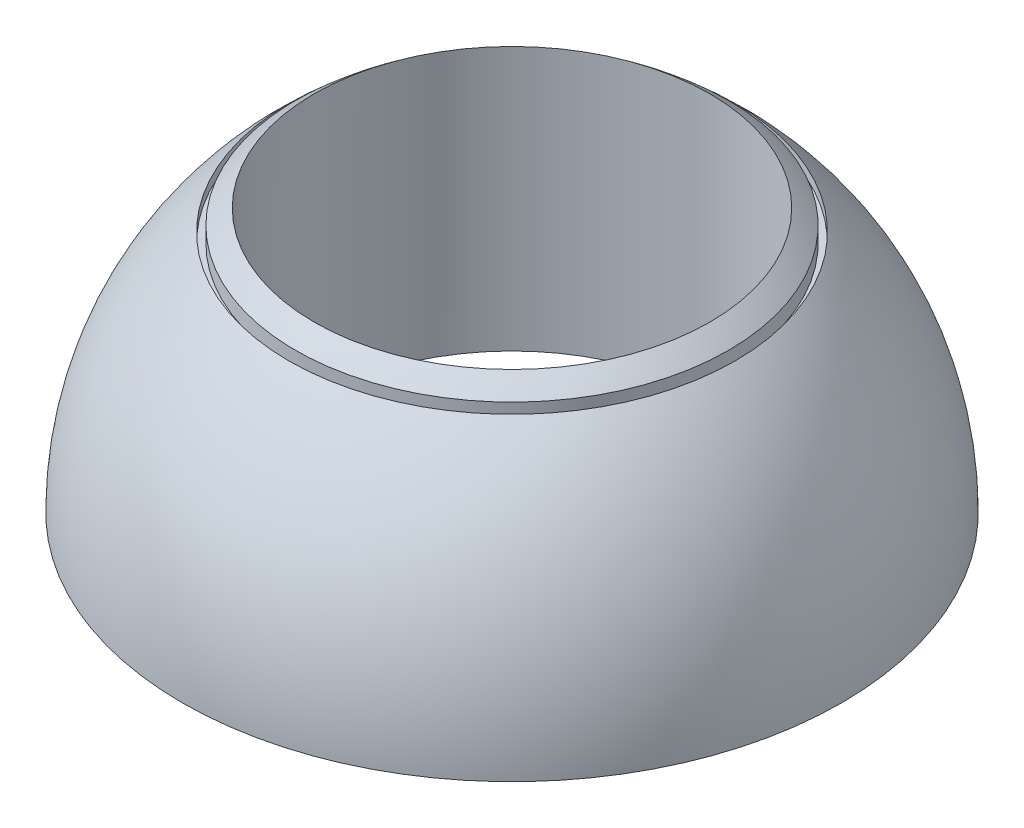
ISO-10303-21;
HEADER;
FILE_DESCRIPTION(('STEP AP214'),'2;1');
FILE_NAME('part.step','',(''),(''),'','','');
FILE_SCHEMA(('AUTOMOTIVE_DESIGN { 1 0 10303 214 1 1 1 1 }'));
ENDSEC;
DATA;
#1=APPLICATION_CONTEXT('core data for automotive mechanical design processes');
#2=APPLICATION_PROTOCOL_DEFINITION('international standard','automotive_design',2000,#1);
#3=PRODUCT_CONTEXT('',#1,'mechanical');
#4=PRODUCT('Part','Part','',(#3));
#5=PRODUCT_RELATED_PRODUCT_CATEGORY('part','',(#4));
#6=PRODUCT_DEFINITION_FORMATION('','',#4);
#7=PRODUCT_DEFINITION_CONTEXT('part definition',#1,'design');
#8=PRODUCT_DEFINITION('design','',#6,#7);
#9=PRODUCT_DEFINITION_SHAPE('','',#8);
#10=(LENGTH_UNIT() NAMED_UNIT(*) SI_UNIT(.MILLI.,.METRE.));
#11=(NAMED_UNIT(*) PLANE_ANGLE_UNIT() SI_UNIT($,.RADIAN.));
#12=(NAMED_UNIT(*) SI_UNIT($,.STERADIAN.) SOLID_ANGLE_UNIT());
#13=UNCERTAINTY_MEASURE_WITH_UNIT(LENGTH_MEASURE(1.E-05),#10,'distance_accuracy_value','');
#14=(GEOMETRIC_REPRESENTATION_CONTEXT(3) GLOBAL_UNCERTAINTY_ASSIGNED_CONTEXT((#13)) GLOBAL_UNIT_ASSIGNED_CONTEXT((#10,
#11,#12)) REPRESENTATION_CONTEXT('',''));
#15=CARTESIAN_POINT('',(0.,0.,0.));
#16=DIRECTION('',(0.,0.,1.));
#17=DIRECTION('',(1.,0.,0.));
#18=AXIS2_PLACEMENT_3D('',#15,#16,#17);
#19=CARTESIAN_POINT('',(0.,0.,0.));
#20=DIRECTION('',(0.,-1.,0.));
#21=DIRECTION('',(1.,0.,0.));
#22=AXIS2_PLACEMENT_3D('',#19,#20,#21);
#23=SPHERICAL_SURFACE('',#22,5.);
#24=CARTESIAN_POINT('',(0.,3.68170305706874,0.));
#25=DIRECTION('',(0.,-1.,0.));
#26=DIRECTION('',(0.,0.,-1.));
#27=AXIS2_PLACEMENT_3D('',#24,#25,#26);
#28=CIRCLE('',#27,3.38305521674871);
#29=CARTESIAN_POINT('',(0.,3.68170305706874,-3.38305521674871));
#30=VERTEX_POINT('',#29);
#31=EDGE_CURVE('E34',#30,#30,#28,.F.);
#32=ORIENTED_EDGE('',*,*,#31,.F.);
#33=EDGE_LOOP('',(#32));
#34=FACE_BOUND('',#33,.T.);
#35=CARTESIAN_POINT('',(0.,0.,0.));
#36=DIRECTION('',(0.,-1.,0.));
#37=DIRECTION('',(0.,0.,-1.));
#38=AXIS2_PLACEMENT_3D('',#35,#36,#37);
#39=CIRCLE('',#38,5.);
#40=CARTESIAN_POINT('',(0.,0.,-5.));
#41=VERTEX_POINT('',#40);
#42=EDGE_CURVE('E43',#41,#41,#39,.T.);
#43=ORIENTED_EDGE('',*,*,#42,.F.);
#44=EDGE_LOOP('',(#43));
#45=FACE_BOUND('',#44,.T.);
#46=ADVANCED_FACE('F30',(#34,#45),#23,.T.);
#47=CARTESIAN_POINT('',(0.,3.7711468340253,0.));
#48=DIRECTION('',(0.,-1.,0.));
#49=DIRECTION('',(0.,0.,-1.));
#50=AXIS2_PLACEMENT_3D('',#47,#48,#49);
#51=CIRCLE('',#50,3.28305521674871);
#52=CARTESIAN_POINT('',(3.28305521674871,3.7711468340253,0.));
#53=VERTEX_POINT('',#52);
#54=EDGE_CURVE('E46',#53,#53,#51,.T.);
#55=CARTESIAN_POINT('',(0.,4.,0.));
#56=DIRECTION('',(0.,-1.,0.));
#57=DIRECTION('',(0.,0.,-1.));
#58=AXIS2_PLACEMENT_3D('',#55,#56,#57);
#59=CIRCLE('',#58,3.);
#60=CARTESIAN_POINT('',(3.,4.,0.));
#61=VERTEX_POINT('',#60);
#62=EDGE_CURVE('E10',#61,#61,#59,.T.);
#63=CARTESIAN_POINT('',(3.28305521674871,3.7711468340253,0.));
#64=CARTESIAN_POINT('',(3.28019481981438,3.77363701580041,0.));
#65=CARTESIAN_POINT('',(3.27733158968318,3.7761239431674,0.));
#66=CARTESIAN_POINT('',(3.27159947787545,3.78109127623487,0.));
#67=CARTESIAN_POINT('',(3.26873059619892,3.78357168193536,0.));
#68=CARTESIAN_POINT('',(3.26298719614895,3.78852595881956,0.));
#69=CARTESIAN_POINT('',(3.26011267777549,3.79099983000328,0.));
#70=CARTESIAN_POINT('',(3.2543580192171,3.79594102504658,0.));
#71=CARTESIAN_POINT('',(3.25147787903216,3.79840834890616,0.));
#72=CARTESIAN_POINT('',(3.24571199176324,3.80333643652526,0.));
#73=CARTESIAN_POINT('',(3.24282624467925,3.80579720028478,0.));
#74=CARTESIAN_POINT('',(3.23704915855426,3.8107121549625,0.));
#75=CARTESIAN_POINT('',(3.23415781951326,3.81316634588069,0.));
#76=CARTESIAN_POINT('',(3.22836956444509,3.81806814216831,0.));
#77=CARTESIAN_POINT('',(3.22547264841792,3.82051574753773,0.));
#78=CARTESIAN_POINT('',(3.21967325437716,3.82540436005454,0.));
#79=CARTESIAN_POINT('',(3.21677077636357,3.82784536720192,0.));
#80=CARTESIAN_POINT('',(3.21096027337852,3.83272077063551,0.));
#81=CARTESIAN_POINT('',(3.20805224840705,3.83515516692172,0.));
#82=CARTESIAN_POINT('',(3.20223066656353,3.84001733602806,0.));
#83=CARTESIAN_POINT('',(3.19931710969146,3.84244510884819,0.));
#84=CARTESIAN_POINT('',(3.19348447913264,3.84729401845178,0.));
#85=CARTESIAN_POINT('',(3.19056540544588,3.84971515523524,0.));
#86=CARTESIAN_POINT('',(3.18472175637215,3.85455078022924,0.));
#87=CARTESIAN_POINT('',(3.18179718098517,3.85696526843978,0.));
#88=CARTESIAN_POINT('',(3.17594254365397,3.86178758378612,0.));
#89=CARTESIAN_POINT('',(3.17301248170974,3.86419541092193,0.));
#90=CARTESIAN_POINT('',(3.1671468864354,3.86900439165148,0.));
#91=CARTESIAN_POINT('',(3.16421135310529,3.87140554524522,0.));
#92=CARTESIAN_POINT('',(3.15833483025889,3.87620116645788,0.));
#93=CARTESIAN_POINT('',(3.1553938407426,3.87859563407679,0.));
#94=CARTESIAN_POINT('',(3.1495064207518,3.88337787094162,0.));
#95=CARTESIAN_POINT('',(3.14655999027728,3.88576564018755,0.));
#96=CARTESIAN_POINT('',(3.14066170362615,3.89053446794294,0.));
#97=CARTESIAN_POINT('',(3.13770984744953,3.8929155264524,0.));
#98=CARTESIAN_POINT('',(3.13180072467841,3.89767092040615,0.));
#99=CARTESIAN_POINT('',(3.1288434580839,3.90004525585043,0.));
#100=CARTESIAN_POINT('',(3.12292352978925,3.9047871913799,0.));
#101=CARTESIAN_POINT('',(3.1199608680891,3.90715479146509,0.));
#102=CARTESIAN_POINT('',(3.11403016492331,3.91188324401734,0.));
#103=CARTESIAN_POINT('',(3.11106212345767,3.91424409648439,0.));
#104=CARTESIAN_POINT('',(3.10512067612894,3.91895904157627,0.));
#105=CARTESIAN_POINT('',(3.10214727026585,3.9213131342011,0.));
#106=CARTESIAN_POINT('',(3.096195109538,3.92601454741942,0.));
#107=CARTESIAN_POINT('',(3.09321635467324,3.92836186801291,0.));
#108=CARTESIAN_POINT('',(3.08725351136557,3.93304972501453,0.));
#109=CARTESIAN_POINT('',(3.08426942292265,3.93539026142266,0.));
#110=CARTESIAN_POINT('',(3.07829592790976,3.94006453793464,0.));
#111=CARTESIAN_POINT('',(3.07530652133978,3.94239827803849,0.));
#112=CARTESIAN_POINT('',(3.06932240555144,3.94705894985822,0.));
#113=CARTESIAN_POINT('',(3.06632769633306,3.94938588157408,0.));
#114=CARTESIAN_POINT('',(3.060332990754,3.95403292456936,0.));
#115=CARTESIAN_POINT('',(3.05733299439333,3.95635303584878,0.));
#116=CARTESIAN_POINT('',(3.05132773006315,3.960986425958,0.));
#117=CARTESIAN_POINT('',(3.04832246209365,3.9632997047878,0.));
#118=CARTESIAN_POINT('',(3.04230667010663,3.96791941802007,0.));
#119=CARTESIAN_POINT('',(3.0392961460891,3.97022585242253,0.));
#120=CARTESIAN_POINT('',(3.03326985759392,3.97483186485764,0.));
#121=CARTESIAN_POINT('',(3.03025409311626,3.97713144289028,0.));
#122=CARTESIAN_POINT('',(3.02421733931633,3.98172373067945,0.));
#123=CARTESIAN_POINT('',(3.02119634999406,3.98401644043598,0.));
#124=CARTESIAN_POINT('',(3.01514916214558,3.98859497979965,0.));
#125=CARTESIAN_POINT('',(3.01212296361936,3.99088080940678,0.));
#126=CARTESIAN_POINT('',(3.00606537303781,3.99544557664354,0.));
#127=CARTESIAN_POINT('',(3.00303398098248,3.99772451427317,0.));
#128=CARTESIAN_POINT('',(3.,4.,0.));
#129=B_SPLINE_CURVE_WITH_KNOTS('',3,(#63,#64,#65,#66,#67,#68,#69,#70,#71,#72,#73,#74,#75,#76,
#77,#78,#79,#80,#81,#82,#83,#84,#85,#86,#87,#88,#89,#90,#91,#92,#93,#94,#95,#96,#97,#98,#99,
#100,#101,#102,#103,#104,#105,#106,#107,#108,#109,#110,#111,#112,#113,#114,#115,#116,#117,#118,
#119,#120,#121,#122,#123,#124,#125,#126,#127,#128),.UNSPECIFIED.,.F.,.F.,(4,2,2,2,2,2,2,2,2,2,2,
2,2,2,2,2,2,2,2,2,2,2,2,2,2,2,2,2,2,2,2,2,4),(0.,0.0113774262115756,0.0227548524231512,
0.034132278634727,0.0455097048463027,0.0568871310578788,0.0682645572694545,0.07964198348103,
0.0910194096926057,0.102396835904182,0.113774262115757,0.125151688327333,0.136529114538909,
0.147906540750485,0.15928396696206,0.170661393173636,0.182038819385212,0.193416245596787,
0.204793671808363,0.216171098019939,0.227548524231514,0.238925950443091,0.250303376654666,
0.261680802866242,0.273058229077818,0.284435655289394,0.295813081500969,0.307190507712545,
0.31856793392412,0.329945360135696,0.341322786347272,0.352700212558848,0.364077638770423),.UNSPECIFIED.);
#130=EDGE_CURVE('BSEAM32',#53,#61,#129,.T.);
#131=ORIENTED_EDGE('',*,*,#54,.F.);
#132=ORIENTED_EDGE('',*,*,#62,.T.);
#133=ORIENTED_EDGE('',*,*,#130,.T.);
#134=ORIENTED_EDGE('',*,*,#130,.F.);
#135=EDGE_LOOP('',(#131,#133,#132,#134));
#136=FACE_BOUND('',#135,.T.);
#137=ADVANCED_FACE('F32',(#136),#23,.T.);
#138=CARTESIAN_POINT('',(0.,0.,0.));
#139=DIRECTION('',(0.,-1.,0.));
#140=DIRECTION('',(0.,0.,-1.));
#141=AXIS2_PLACEMENT_3D('',#138,#139,#140);
#142=CYLINDRICAL_SURFACE('',#141,3.);
#143=CARTESIAN_POINT('',(0.,0.,0.));
#144=DIRECTION('',(0.,-1.,0.));
#145=DIRECTION('',(0.,0.,-1.));
#146=AXIS2_PLACEMENT_3D('',#143,#144,#145);
#147=CIRCLE('',#146,3.);
#148=CARTESIAN_POINT('',(0.,0.,-3.));
#149=VERTEX_POINT('',#148);
#150=EDGE_CURVE('E38',#149,#149,#147,.T.);
#151=ORIENTED_EDGE('',*,*,#150,.T.);
#152=EDGE_LOOP('',(#151));
#153=FACE_BOUND('',#152,.T.);
#154=ORIENTED_EDGE('',*,*,#62,.F.);
#155=EDGE_LOOP('',(#154));
#156=FACE_BOUND('',#155,.T.);
#157=ADVANCED_FACE('F70',(#153,#156),#142,.F.);
#158=CARTESIAN_POINT('',(3.,0.,0.));
#159=DIRECTION('',(0.,-1.,0.));
#160=DIRECTION('',(0.,0.,-1.));
#161=AXIS2_PLACEMENT_3D('',#158,#159,#160);
#162=PLANE('',#161);
#163=ORIENTED_EDGE('',*,*,#42,.T.);
#164=EDGE_LOOP('',(#163));
#165=FACE_BOUND('',#164,.T.);
#166=ORIENTED_EDGE('',*,*,#150,.F.);
#167=EDGE_LOOP('',(#166));
#168=FACE_BOUND('',#167,.T.);
#169=ADVANCED_FACE('F62',(#165,#168),#162,.T.);
#170=CARTESIAN_POINT('',(0.,0.,0.));
#171=DIRECTION('',(0.,-1.,0.));
#172=DIRECTION('',(0.,0.,-1.));
#173=AXIS2_PLACEMENT_3D('',#170,#171,#172);
#174=CYLINDRICAL_SURFACE('',#173,3.38305521674871);
#175=ORIENTED_EDGE('',*,*,#31,.T.);
#176=EDGE_LOOP('',(#175));
#177=FACE_BOUND('',#176,.T.);
#178=CARTESIAN_POINT('',(0.,3.53723962995749,0.));
#179=DIRECTION('',(0.,-1.,0.));
#180=DIRECTION('',(0.,0.,-1.));
#181=AXIS2_PLACEMENT_3D('',#178,#179,#180);
#182=CIRCLE('',#181,3.38305521674871);
#183=CARTESIAN_POINT('',(0.,3.53723962995749,-3.38305521674871));
#184=VERTEX_POINT('',#183);
#185=EDGE_CURVE('E48',#184,#184,#182,.T.);
#186=ORIENTED_EDGE('',*,*,#185,.T.);
#187=EDGE_LOOP('',(#186));
#188=FACE_BOUND('',#187,.T.);
#189=ADVANCED_FACE('F74',(#177,#188),#174,.F.);
#190=CARTESIAN_POINT('',(0.,3.53723962995749,-3.28305521674871));
#191=DIRECTION('',(0.,-1.,0.));
#192=DIRECTION('',(0.,0.,-1.));
#193=AXIS2_PLACEMENT_3D('',#190,#191,#192);
#194=PLANE('',#193);
#195=ORIENTED_EDGE('',*,*,#185,.F.);
#196=EDGE_LOOP('',(#195));
#197=FACE_BOUND('',#196,.T.);
#198=CARTESIAN_POINT('',(0.,3.53723962995749,0.));
#199=DIRECTION('',(0.,-1.,0.));
#200=DIRECTION('',(0.,0.,-1.));
#201=AXIS2_PLACEMENT_3D('',#198,#199,#200);
#202=CIRCLE('',#201,3.28305521674871);
#203=CARTESIAN_POINT('',(0.,3.53723962995749,-3.28305521674871));
#204=VERTEX_POINT('',#203);
#205=EDGE_CURVE('E53',#204,#204,#202,.T.);
#206=ORIENTED_EDGE('',*,*,#205,.T.);
#207=EDGE_LOOP('',(#206));
#208=FACE_BOUND('',#207,.T.);
#209=ADVANCED_FACE('F76',(#197,#208),#194,.F.);
#210=CARTESIAN_POINT('',(0.,0.,0.));
#211=DIRECTION('',(0.,-1.,0.));
#212=DIRECTION('',(0.,0.,-1.));
#213=AXIS2_PLACEMENT_3D('',#210,#211,#212);
#214=CYLINDRICAL_SURFACE('',#213,3.28305521674871);
#215=ORIENTED_EDGE('',*,*,#54,.T.);
#216=EDGE_LOOP('',(#215));
#217=FACE_BOUND('',#216,.T.);
#218=ORIENTED_EDGE('',*,*,#205,.F.);
#219=EDGE_LOOP('',(#218));
#220=FACE_BOUND('',#219,.T.);
#221=ADVANCED_FACE('F82',(#217,#220),#214,.T.);
#222=CLOSED_SHELL('',(#46,#137,#157,#169,#189,#209,#221));
#223=MANIFOLD_SOLID_BREP('B2',#222);
#224=ADVANCED_BREP_SHAPE_REPRESENTATION('',(#18,#223),#14);
#225=SHAPE_DEFINITION_REPRESENTATION(#9,#224);
ENDSEC;
END-ISO-10303-21;
